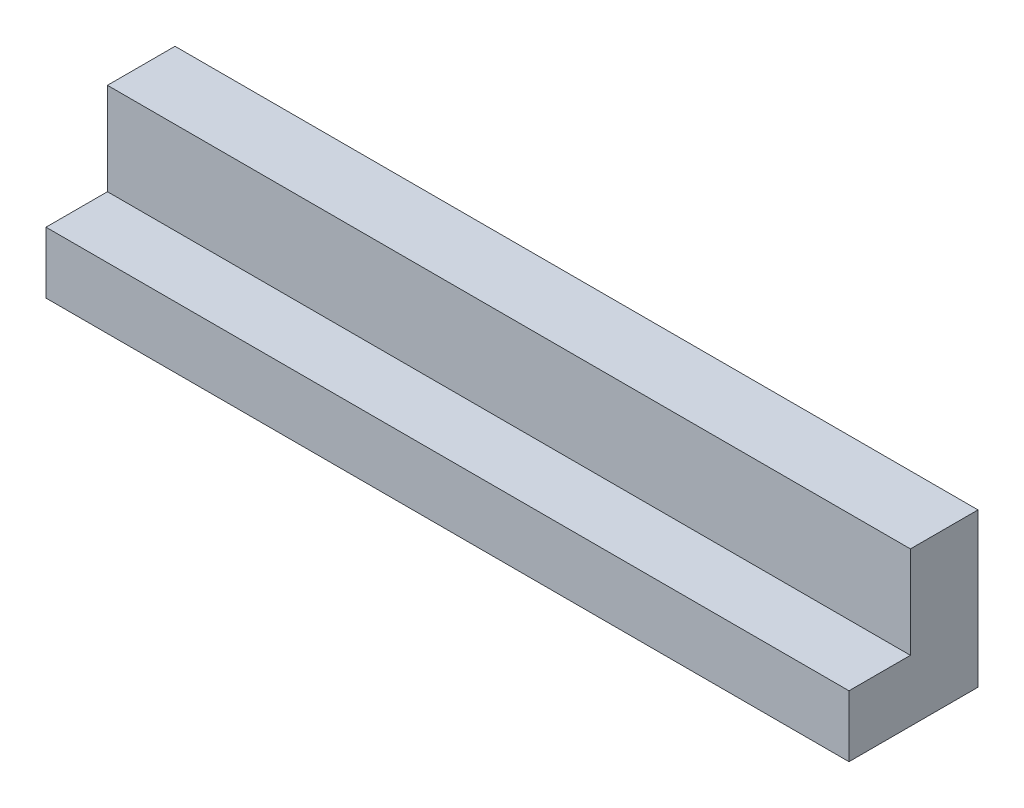
ISO-10303-21;
HEADER;
FILE_DESCRIPTION(('STEP AP214'),'2;1');
FILE_NAME('part.step','',(''),(''),'','','');
FILE_SCHEMA(('AUTOMOTIVE_DESIGN { 1 0 10303 214 1 1 1 1 }'));
ENDSEC;
DATA;
#1=APPLICATION_CONTEXT('core data for automotive mechanical design processes');
#2=APPLICATION_PROTOCOL_DEFINITION('international standard','automotive_design',2000,#1);
#3=PRODUCT_CONTEXT('',#1,'mechanical');
#4=PRODUCT('Part','Part','',(#3));
#5=PRODUCT_RELATED_PRODUCT_CATEGORY('part','',(#4));
#6=PRODUCT_DEFINITION_FORMATION('','',#4);
#7=PRODUCT_DEFINITION_CONTEXT('part definition',#1,'design');
#8=PRODUCT_DEFINITION('design','',#6,#7);
#9=PRODUCT_DEFINITION_SHAPE('','',#8);
#10=(LENGTH_UNIT() NAMED_UNIT(*) SI_UNIT(.MILLI.,.METRE.));
#11=(NAMED_UNIT(*) PLANE_ANGLE_UNIT() SI_UNIT($,.RADIAN.));
#12=(NAMED_UNIT(*) SI_UNIT($,.STERADIAN.) SOLID_ANGLE_UNIT());
#13=UNCERTAINTY_MEASURE_WITH_UNIT(LENGTH_MEASURE(1.E-05),#10,'distance_accuracy_value','');
#14=(GEOMETRIC_REPRESENTATION_CONTEXT(3) GLOBAL_UNCERTAINTY_ASSIGNED_CONTEXT((#13)) GLOBAL_UNIT_ASSIGNED_CONTEXT((#10,
#11,#12)) REPRESENTATION_CONTEXT('',''));
#15=CARTESIAN_POINT('',(0.,0.,0.));
#16=DIRECTION('',(0.,0.,1.));
#17=DIRECTION('',(1.,0.,0.));
#18=AXIS2_PLACEMENT_3D('',#15,#16,#17);
#19=CARTESIAN_POINT('',(261.4,0.,42.));
#20=DIRECTION('',(-1.,0.,0.));
#21=DIRECTION('',(0.,0.,1.));
#22=AXIS2_PLACEMENT_3D('',#19,#20,#21);
#23=PLANE('',#22);
#24=DIRECTION('',(0.,0.,-1.));
#25=VECTOR('',#24,1.);
#26=CARTESIAN_POINT('',(261.4,20.,431.290829002216));
#27=LINE('',#26,#25);
#28=CARTESIAN_POINT('',(261.4,20.,42.0000000000001));
#29=VERTEX_POINT('',#28);
#30=CARTESIAN_POINT('',(261.4,20.,22.0000000000001));
#31=VERTEX_POINT('',#30);
#32=EDGE_CURVE('E99',#29,#31,#27,.T.);
#33=ORIENTED_EDGE('',*,*,#32,.F.);
#34=DIRECTION('',(0.,1.,0.));
#35=VECTOR('',#34,1.);
#36=CARTESIAN_POINT('',(261.4,0.,42.));
#37=LINE('',#36,#35);
#38=CARTESIAN_POINT('',(261.4,0.,42.));
#39=VERTEX_POINT('',#38);
#40=EDGE_CURVE('E88',#39,#29,#37,.T.);
#41=ORIENTED_EDGE('',*,*,#40,.F.);
#42=DIRECTION('',(0.,0.,-1.));
#43=VECTOR('',#42,1.);
#44=CARTESIAN_POINT('',(261.4,0.,42.));
#45=LINE('',#44,#43);
#46=CARTESIAN_POINT('',(261.4,0.,0.));
#47=VERTEX_POINT('',#46);
#48=EDGE_CURVE('E41',#39,#47,#45,.T.);
#49=ORIENTED_EDGE('',*,*,#48,.T.);
#50=DIRECTION('',(0.,1.,0.));
#51=VECTOR('',#50,1.);
#52=CARTESIAN_POINT('',(261.4,0.,0.));
#53=LINE('',#52,#51);
#54=CARTESIAN_POINT('',(261.4,50.,0.));
#55=VERTEX_POINT('',#54);
#56=EDGE_CURVE('E123',#47,#55,#53,.T.);
#57=ORIENTED_EDGE('',*,*,#56,.T.);
#58=DIRECTION('',(0.,0.,-1.));
#59=VECTOR('',#58,1.);
#60=CARTESIAN_POINT('',(261.4,50.,42.));
#61=LINE('',#60,#59);
#62=CARTESIAN_POINT('',(261.4,50.,22.));
#63=VERTEX_POINT('',#62);
#64=EDGE_CURVE('E129',#63,#55,#61,.T.);
#65=ORIENTED_EDGE('',*,*,#64,.F.);
#66=DIRECTION('',(0.,1.,0.));
#67=VECTOR('',#66,1.);
#68=CARTESIAN_POINT('',(261.4,0.,22.));
#69=LINE('',#68,#67);
#70=EDGE_CURVE('E56',#31,#63,#69,.T.);
#71=ORIENTED_EDGE('',*,*,#70,.F.);
#72=EDGE_LOOP('',(#33,#41,#49,#57,#65,#71));
#73=FACE_BOUND('',#72,.T.);
#74=ADVANCED_FACE('F33',(#73),#23,.F.);
#75=CARTESIAN_POINT('',(261.4,50.,42.));
#76=DIRECTION('',(0.,-1.,0.));
#77=DIRECTION('',(1.,0.,0.));
#78=AXIS2_PLACEMENT_3D('',#75,#76,#77);
#79=PLANE('',#78);
#80=DIRECTION('',(-1.,0.,0.));
#81=VECTOR('',#80,1.);
#82=CARTESIAN_POINT('',(261.4,50.,22.));
#83=LINE('',#82,#81);
#84=CARTESIAN_POINT('',(0.,50.,22.));
#85=VERTEX_POINT('',#84);
#86=EDGE_CURVE('E115',#63,#85,#83,.T.);
#87=ORIENTED_EDGE('',*,*,#86,.F.);
#88=ORIENTED_EDGE('',*,*,#64,.T.);
#89=DIRECTION('',(-1.,0.,0.));
#90=VECTOR('',#89,1.);
#91=CARTESIAN_POINT('',(261.4,50.,0.));
#92=LINE('',#91,#90);
#93=CARTESIAN_POINT('',(0.,50.,0.));
#94=VERTEX_POINT('',#93);
#95=EDGE_CURVE('E120',#55,#94,#92,.T.);
#96=ORIENTED_EDGE('',*,*,#95,.T.);
#97=DIRECTION('',(0.,0.,-1.));
#98=VECTOR('',#97,1.);
#99=CARTESIAN_POINT('',(0.,50.,42.));
#100=LINE('',#99,#98);
#101=EDGE_CURVE('E96',#85,#94,#100,.T.);
#102=ORIENTED_EDGE('',*,*,#101,.F.);
#103=EDGE_LOOP('',(#87,#88,#96,#102));
#104=FACE_BOUND('',#103,.T.);
#105=ADVANCED_FACE('F138',(#104),#79,.F.);
#106=CARTESIAN_POINT('',(0.,50.,42.));
#107=DIRECTION('',(1.,0.,0.));
#108=DIRECTION('',(0.,0.,-1.));
#109=AXIS2_PLACEMENT_3D('',#106,#107,#108);
#110=PLANE('',#109);
#111=DIRECTION('',(0.,-1.,0.));
#112=VECTOR('',#111,1.);
#113=CARTESIAN_POINT('',(0.,50.,42.));
#114=LINE('',#113,#112);
#115=CARTESIAN_POINT('',(0.,20.,42.));
#116=VERTEX_POINT('',#115);
#117=CARTESIAN_POINT('',(0.,0.,42.));
#118=VERTEX_POINT('',#117);
#119=EDGE_CURVE('E118',#116,#118,#114,.T.);
#120=ORIENTED_EDGE('',*,*,#119,.F.);
#121=DIRECTION('',(0.,0.,-1.));
#122=VECTOR('',#121,1.);
#123=CARTESIAN_POINT('',(0.,20.,431.290829002216));
#124=LINE('',#123,#122);
#125=CARTESIAN_POINT('',(0.,20.,22.0000000000001));
#126=VERTEX_POINT('',#125);
#127=EDGE_CURVE('E48',#116,#126,#124,.T.);
#128=ORIENTED_EDGE('',*,*,#127,.T.);
#129=DIRECTION('',(0.,-1.,0.));
#130=VECTOR('',#129,1.);
#131=CARTESIAN_POINT('',(0.,50.,22.));
#132=LINE('',#131,#130);
#133=EDGE_CURVE('E112',#85,#126,#132,.T.);
#134=ORIENTED_EDGE('',*,*,#133,.F.);
#135=ORIENTED_EDGE('',*,*,#101,.T.);
#136=DIRECTION('',(0.,-1.,0.));
#137=VECTOR('',#136,1.);
#138=CARTESIAN_POINT('',(0.,50.,0.));
#139=LINE('',#138,#137);
#140=CARTESIAN_POINT('',(0.,0.,0.));
#141=VERTEX_POINT('',#140);
#142=EDGE_CURVE('E105',#94,#141,#139,.T.);
#143=ORIENTED_EDGE('',*,*,#142,.T.);
#144=DIRECTION('',(0.,0.,-1.));
#145=VECTOR('',#144,1.);
#146=CARTESIAN_POINT('',(0.,0.,42.));
#147=LINE('',#146,#145);
#148=EDGE_CURVE('E11',#118,#141,#147,.T.);
#149=ORIENTED_EDGE('',*,*,#148,.F.);
#150=EDGE_LOOP('',(#120,#128,#134,#135,#143,#149));
#151=FACE_BOUND('',#150,.T.);
#152=ADVANCED_FACE('F35',(#151),#110,.F.);
#153=CARTESIAN_POINT('',(0.,0.,42.));
#154=DIRECTION('',(0.,1.,0.));
#155=DIRECTION('',(0.,0.,1.));
#156=AXIS2_PLACEMENT_3D('',#153,#154,#155);
#157=PLANE('',#156);
#158=DIRECTION('',(1.,0.,0.));
#159=VECTOR('',#158,1.);
#160=CARTESIAN_POINT('',(0.,0.,0.));
#161=LINE('',#160,#159);
#162=EDGE_CURVE('E108',#141,#47,#161,.T.);
#163=ORIENTED_EDGE('',*,*,#162,.T.);
#164=ORIENTED_EDGE('',*,*,#48,.F.);
#165=DIRECTION('',(1.,0.,0.));
#166=VECTOR('',#165,1.);
#167=CARTESIAN_POINT('',(0.,0.,42.));
#168=LINE('',#167,#166);
#169=EDGE_CURVE('E93',#118,#39,#168,.T.);
#170=ORIENTED_EDGE('',*,*,#169,.F.);
#171=ORIENTED_EDGE('',*,*,#148,.T.);
#172=EDGE_LOOP('',(#163,#164,#170,#171));
#173=FACE_BOUND('',#172,.T.);
#174=ADVANCED_FACE('F143',(#173),#157,.F.);
#175=CARTESIAN_POINT('',(0.,0.,42.));
#176=DIRECTION('',(0.,0.,1.));
#177=DIRECTION('',(1.,0.,0.));
#178=AXIS2_PLACEMENT_3D('',#175,#176,#177);
#179=PLANE('',#178);
#180=DIRECTION('',(1.,0.,0.));
#181=VECTOR('',#180,1.);
#182=CARTESIAN_POINT('',(0.,20.,42.));
#183=LINE('',#182,#181);
#184=EDGE_CURVE('E91',#116,#29,#183,.T.);
#185=ORIENTED_EDGE('',*,*,#184,.F.);
#186=ORIENTED_EDGE('',*,*,#119,.T.);
#187=ORIENTED_EDGE('',*,*,#169,.T.);
#188=ORIENTED_EDGE('',*,*,#40,.T.);
#189=EDGE_LOOP('',(#185,#186,#187,#188));
#190=FACE_BOUND('',#189,.T.);
#191=ADVANCED_FACE('F89',(#190),#179,.T.);
#192=CARTESIAN_POINT('',(0.,0.,0.));
#193=DIRECTION('',(0.,0.,1.));
#194=DIRECTION('',(1.,0.,0.));
#195=AXIS2_PLACEMENT_3D('',#192,#193,#194);
#196=PLANE('',#195);
#197=ORIENTED_EDGE('',*,*,#142,.F.);
#198=ORIENTED_EDGE('',*,*,#95,.F.);
#199=ORIENTED_EDGE('',*,*,#56,.F.);
#200=ORIENTED_EDGE('',*,*,#162,.F.);
#201=EDGE_LOOP('',(#197,#198,#199,#200));
#202=FACE_BOUND('',#201,.T.);
#203=ADVANCED_FACE('F135',(#202),#196,.F.);
#204=CARTESIAN_POINT('',(0.,20.,431.290829002216));
#205=DIRECTION('',(0.,1.,0.));
#206=DIRECTION('',(0.,0.,1.));
#207=AXIS2_PLACEMENT_3D('',#204,#205,#206);
#208=PLANE('',#207);
#209=ORIENTED_EDGE('',*,*,#127,.F.);
#210=ORIENTED_EDGE('',*,*,#184,.T.);
#211=ORIENTED_EDGE('',*,*,#32,.T.);
#212=DIRECTION('',(1.,0.,0.));
#213=VECTOR('',#212,1.);
#214=CARTESIAN_POINT('',(0.,20.,22.));
#215=LINE('',#214,#213);
#216=EDGE_CURVE('E102',#126,#31,#215,.T.);
#217=ORIENTED_EDGE('',*,*,#216,.F.);
#218=EDGE_LOOP('',(#209,#210,#211,#217));
#219=FACE_BOUND('',#218,.T.);
#220=ADVANCED_FACE('F104',(#219),#208,.T.);
#221=CARTESIAN_POINT('',(0.,0.,22.));
#222=DIRECTION('',(0.,0.,1.));
#223=DIRECTION('',(1.,0.,0.));
#224=AXIS2_PLACEMENT_3D('',#221,#222,#223);
#225=PLANE('',#224);
#226=ORIENTED_EDGE('',*,*,#216,.T.);
#227=ORIENTED_EDGE('',*,*,#70,.T.);
#228=ORIENTED_EDGE('',*,*,#86,.T.);
#229=ORIENTED_EDGE('',*,*,#133,.T.);
#230=EDGE_LOOP('',(#226,#227,#228,#229));
#231=FACE_BOUND('',#230,.T.);
#232=ADVANCED_FACE('F140',(#231),#225,.T.);
#233=CLOSED_SHELL('',(#74,#105,#152,#174,#191,#203,#220,#232));
#234=MANIFOLD_SOLID_BREP('B2',#233);
#235=ADVANCED_BREP_SHAPE_REPRESENTATION('',(#18,#234),#14);
#236=SHAPE_DEFINITION_REPRESENTATION(#9,#235);
ENDSEC;
END-ISO-10303-21;
